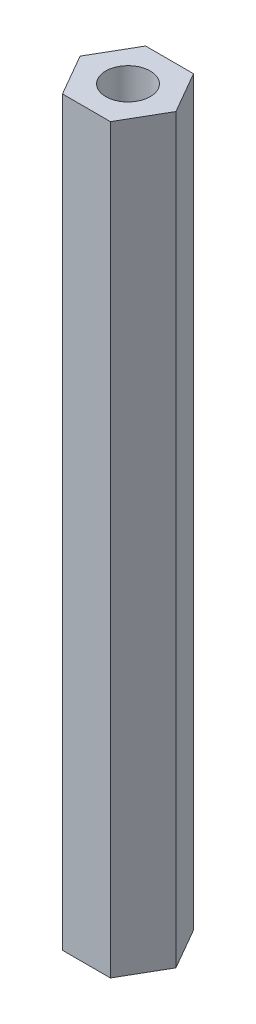
ISO-10303-21;
HEADER;
FILE_DESCRIPTION(('STEP AP214'),'2;1');
FILE_NAME('part.step','',(''),(''),'','','');
FILE_SCHEMA(('AUTOMOTIVE_DESIGN { 1 0 10303 214 1 1 1 1 }'));
ENDSEC;
DATA;
#1=APPLICATION_CONTEXT('core data for automotive mechanical design processes');
#2=APPLICATION_PROTOCOL_DEFINITION('international standard','automotive_design',2000,#1);
#3=PRODUCT_CONTEXT('',#1,'mechanical');
#4=PRODUCT('Part','Part','',(#3));
#5=PRODUCT_RELATED_PRODUCT_CATEGORY('part','',(#4));
#6=PRODUCT_DEFINITION_FORMATION('','',#4);
#7=PRODUCT_DEFINITION_CONTEXT('part definition',#1,'design');
#8=PRODUCT_DEFINITION('design','',#6,#7);
#9=PRODUCT_DEFINITION_SHAPE('','',#8);
#10=(LENGTH_UNIT() NAMED_UNIT(*) SI_UNIT(.MILLI.,.METRE.));
#11=(NAMED_UNIT(*) PLANE_ANGLE_UNIT() SI_UNIT($,.RADIAN.));
#12=(NAMED_UNIT(*) SI_UNIT($,.STERADIAN.) SOLID_ANGLE_UNIT());
#13=UNCERTAINTY_MEASURE_WITH_UNIT(LENGTH_MEASURE(1.E-05),#10,'distance_accuracy_value','');
#14=(GEOMETRIC_REPRESENTATION_CONTEXT(3) GLOBAL_UNCERTAINTY_ASSIGNED_CONTEXT((#13)) GLOBAL_UNIT_ASSIGNED_CONTEXT((#10,
#11,#12)) REPRESENTATION_CONTEXT('',''));
#15=CARTESIAN_POINT('',(0.,0.,0.));
#16=DIRECTION('',(0.,0.,1.));
#17=DIRECTION('',(1.,0.,0.));
#18=AXIS2_PLACEMENT_3D('',#15,#16,#17);
#19=CARTESIAN_POINT('',(0.,50.,0.));
#20=DIRECTION('',(0.,1.,0.));
#21=DIRECTION('',(0.,0.,1.));
#22=AXIS2_PLACEMENT_3D('',#19,#20,#21);
#23=PLANE('',#22);
#24=DIRECTION('',(-0.499496882066942,0.,-0.866315684266078));
#25=VECTOR('',#24,1.);
#26=CARTESIAN_POINT('',(3.23316096204306,50.,0.00187799205236423));
#27=LINE('',#26,#25);
#28=CARTESIAN_POINT('',(3.23316096204306,50.,0.00187799205236423));
#29=VERTEX_POINT('',#28);
#30=CARTESIAN_POINT('',(1.61820686984698,50.,-2.79906053162724));
#31=VERTEX_POINT('',#30);
#32=EDGE_CURVE('E130',#29,#31,#27,.T.);
#33=ORIENTED_EDGE('',*,*,#32,.T.);
#34=DIRECTION('',(-0.999999831304794,0.,-0.000580853151947535));
#35=VECTOR('',#34,1.);
#36=CARTESIAN_POINT('',(1.61820686984698,50.,-2.79906053162724));
#37=LINE('',#36,#35);
#38=CARTESIAN_POINT('',(-1.61495409219608,50.,-2.8009385236796));
#39=VERTEX_POINT('',#38);
#40=EDGE_CURVE('E88',#31,#39,#37,.T.);
#41=ORIENTED_EDGE('',*,*,#40,.T.);
#42=DIRECTION('',(-0.500502949237851,0.,0.865734831114131));
#43=VECTOR('',#42,1.);
#44=CARTESIAN_POINT('',(-1.61495409219608,50.,-2.8009385236796));
#45=LINE('',#44,#43);
#46=CARTESIAN_POINT('',(-3.23316096204306,50.,-0.00187799205236375));
#47=VERTEX_POINT('',#46);
#48=EDGE_CURVE('E101',#39,#47,#45,.T.);
#49=ORIENTED_EDGE('',*,*,#48,.T.);
#50=DIRECTION('',(0.499496882066942,0.,0.866315684266078));
#51=VECTOR('',#50,1.);
#52=CARTESIAN_POINT('',(-3.23316096204306,50.,-0.00187799205236375));
#53=LINE('',#52,#51);
#54=CARTESIAN_POINT('',(-1.61820686984698,50.,2.79906053162724));
#55=VERTEX_POINT('',#54);
#56=EDGE_CURVE('E95',#47,#55,#53,.T.);
#57=ORIENTED_EDGE('',*,*,#56,.T.);
#58=DIRECTION('',(0.999999831304794,0.,0.000580853151947401));
#59=VECTOR('',#58,1.);
#60=CARTESIAN_POINT('',(-1.61820686984698,50.,2.79906053162724));
#61=LINE('',#60,#59);
#62=CARTESIAN_POINT('',(1.61495409219608,50.,2.8009385236796));
#63=VERTEX_POINT('',#62);
#64=EDGE_CURVE('E99',#55,#63,#61,.T.);
#65=ORIENTED_EDGE('',*,*,#64,.T.);
#66=DIRECTION('',(0.500502949237852,0.,-0.865734831114131));
#67=VECTOR('',#66,1.);
#68=CARTESIAN_POINT('',(1.61495409219608,50.,2.8009385236796));
#69=LINE('',#68,#67);
#70=EDGE_CURVE('E51',#63,#29,#69,.T.);
#71=ORIENTED_EDGE('',*,*,#70,.T.);
#72=EDGE_LOOP('',(#33,#41,#49,#57,#65,#71));
#73=FACE_BOUND('',#72,.T.);
#74=CARTESIAN_POINT('',(0.,50.,0.));
#75=DIRECTION('',(0.,1.,0.));
#76=DIRECTION('',(0.,0.,1.));
#77=AXIS2_PLACEMENT_3D('',#74,#75,#76);
#78=CIRCLE('',#77,1.5);
#79=CARTESIAN_POINT('',(0.,50.,1.5));
#80=VERTEX_POINT('',#79);
#81=EDGE_CURVE('E123',#80,#80,#78,.T.);
#82=ORIENTED_EDGE('',*,*,#81,.F.);
#83=EDGE_LOOP('',(#82));
#84=FACE_BOUND('',#83,.T.);
#85=ADVANCED_FACE('F34',(#73,#84),#23,.T.);
#86=CARTESIAN_POINT('',(0.,0.,0.));
#87=DIRECTION('',(0.,1.,0.));
#88=DIRECTION('',(0.,0.,1.));
#89=AXIS2_PLACEMENT_3D('',#86,#87,#88);
#90=PLANE('',#89);
#91=DIRECTION('',(-0.499496882066942,0.,-0.866315684266078));
#92=VECTOR('',#91,1.);
#93=CARTESIAN_POINT('',(3.23316096204306,0.,0.00187799205236423));
#94=LINE('',#93,#92);
#95=CARTESIAN_POINT('',(3.23316096204306,0.,0.00187799205236423));
#96=VERTEX_POINT('',#95);
#97=CARTESIAN_POINT('',(1.61820686984698,0.,-2.79906053162724));
#98=VERTEX_POINT('',#97);
#99=EDGE_CURVE('E119',#96,#98,#94,.T.);
#100=ORIENTED_EDGE('',*,*,#99,.F.);
#101=DIRECTION('',(0.500502949237852,0.,-0.865734831114131));
#102=VECTOR('',#101,1.);
#103=CARTESIAN_POINT('',(1.61495409219608,0.,2.8009385236796));
#104=LINE('',#103,#102);
#105=CARTESIAN_POINT('',(1.61495409219608,0.,2.8009385236796));
#106=VERTEX_POINT('',#105);
#107=EDGE_CURVE('E80',#106,#96,#104,.T.);
#108=ORIENTED_EDGE('',*,*,#107,.F.);
#109=DIRECTION('',(0.999999831304794,0.,0.000580853151947401));
#110=VECTOR('',#109,1.);
#111=CARTESIAN_POINT('',(-1.61820686984698,0.,2.79906053162724));
#112=LINE('',#111,#110);
#113=CARTESIAN_POINT('',(-1.61820686984698,0.,2.79906053162724));
#114=VERTEX_POINT('',#113);
#115=EDGE_CURVE('E74',#114,#106,#112,.T.);
#116=ORIENTED_EDGE('',*,*,#115,.F.);
#117=DIRECTION('',(0.499496882066942,0.,0.866315684266078));
#118=VECTOR('',#117,1.);
#119=CARTESIAN_POINT('',(-3.23316096204306,0.,-0.00187799205236375));
#120=LINE('',#119,#118);
#121=CARTESIAN_POINT('',(-3.23316096204306,0.,-0.00187799205236375));
#122=VERTEX_POINT('',#121);
#123=EDGE_CURVE('E109',#122,#114,#120,.T.);
#124=ORIENTED_EDGE('',*,*,#123,.F.);
#125=DIRECTION('',(-0.500502949237851,0.,0.865734831114131));
#126=VECTOR('',#125,1.);
#127=CARTESIAN_POINT('',(-1.61495409219608,0.,-2.8009385236796));
#128=LINE('',#127,#126);
#129=CARTESIAN_POINT('',(-1.61495409219608,0.,-2.8009385236796));
#130=VERTEX_POINT('',#129);
#131=EDGE_CURVE('E125',#130,#122,#128,.T.);
#132=ORIENTED_EDGE('',*,*,#131,.F.);
#133=DIRECTION('',(-0.999999831304794,0.,-0.000580853151947535));
#134=VECTOR('',#133,1.);
#135=CARTESIAN_POINT('',(1.61820686984698,0.,-2.79906053162724));
#136=LINE('',#135,#134);
#137=EDGE_CURVE('E122',#98,#130,#136,.T.);
#138=ORIENTED_EDGE('',*,*,#137,.F.);
#139=EDGE_LOOP('',(#100,#108,#116,#124,#132,#138));
#140=FACE_BOUND('',#139,.T.);
#141=CARTESIAN_POINT('',(0.,0.,0.));
#142=DIRECTION('',(0.,1.,0.));
#143=DIRECTION('',(0.,0.,1.));
#144=AXIS2_PLACEMENT_3D('',#141,#142,#143);
#145=CIRCLE('',#144,1.5);
#146=CARTESIAN_POINT('',(0.,0.,1.5));
#147=VERTEX_POINT('',#146);
#148=EDGE_CURVE('E223',#147,#147,#145,.T.);
#149=ORIENTED_EDGE('',*,*,#148,.T.);
#150=EDGE_LOOP('',(#149));
#151=FACE_BOUND('',#150,.T.);
#152=ADVANCED_FACE('F139',(#140,#151),#90,.F.);
#153=CARTESIAN_POINT('',(3.23316096204306,50.,0.00187799205236423));
#154=DIRECTION('',(-0.866315684266078,0.,0.499496882066942));
#155=DIRECTION('',(0.499496882066942,0.,0.866315684266078));
#156=AXIS2_PLACEMENT_3D('',#153,#154,#155);
#157=PLANE('',#156);
#158=ORIENTED_EDGE('',*,*,#99,.T.);
#159=DIRECTION('',(0.,-1.,0.));
#160=VECTOR('',#159,1.);
#161=CARTESIAN_POINT('',(1.61820686984698,50.,-2.79906053162724));
#162=LINE('',#161,#160);
#163=EDGE_CURVE('E11',#31,#98,#162,.T.);
#164=ORIENTED_EDGE('',*,*,#163,.F.);
#165=ORIENTED_EDGE('',*,*,#32,.F.);
#166=DIRECTION('',(0.,-1.,0.));
#167=VECTOR('',#166,1.);
#168=CARTESIAN_POINT('',(3.23316096204306,50.,0.00187799205236423));
#169=LINE('',#168,#167);
#170=EDGE_CURVE('E115',#29,#96,#169,.T.);
#171=ORIENTED_EDGE('',*,*,#170,.T.);
#172=EDGE_LOOP('',(#158,#164,#165,#171));
#173=FACE_BOUND('',#172,.T.);
#174=ADVANCED_FACE('F36',(#173),#157,.F.);
#175=CARTESIAN_POINT('',(1.61820686984698,50.,-2.79906053162724));
#176=DIRECTION('',(-0.000580853151947535,0.,0.999999831304794));
#177=DIRECTION('',(0.999999831304794,0.,0.000580853151947535));
#178=AXIS2_PLACEMENT_3D('',#175,#176,#177);
#179=PLANE('',#178);
#180=ORIENTED_EDGE('',*,*,#137,.T.);
#181=DIRECTION('',(0.,-1.,0.));
#182=VECTOR('',#181,1.);
#183=CARTESIAN_POINT('',(-1.61495409219608,50.,-2.8009385236796));
#184=LINE('',#183,#182);
#185=EDGE_CURVE('E43',#39,#130,#184,.T.);
#186=ORIENTED_EDGE('',*,*,#185,.F.);
#187=ORIENTED_EDGE('',*,*,#40,.F.);
#188=ORIENTED_EDGE('',*,*,#163,.T.);
#189=EDGE_LOOP('',(#180,#186,#187,#188));
#190=FACE_BOUND('',#189,.T.);
#191=ADVANCED_FACE('F164',(#190),#179,.F.);
#192=CARTESIAN_POINT('',(-1.61495409219608,50.,-2.8009385236796));
#193=DIRECTION('',(0.865734831114131,0.,0.500502949237851));
#194=DIRECTION('',(0.500502949237851,0.,-0.865734831114131));
#195=AXIS2_PLACEMENT_3D('',#192,#193,#194);
#196=PLANE('',#195);
#197=ORIENTED_EDGE('',*,*,#131,.T.);
#198=DIRECTION('',(0.,-1.,0.));
#199=VECTOR('',#198,1.);
#200=CARTESIAN_POINT('',(-3.23316096204306,50.,-0.00187799205236375));
#201=LINE('',#200,#199);
#202=EDGE_CURVE('E110',#47,#122,#201,.T.);
#203=ORIENTED_EDGE('',*,*,#202,.F.);
#204=ORIENTED_EDGE('',*,*,#48,.F.);
#205=ORIENTED_EDGE('',*,*,#185,.T.);
#206=EDGE_LOOP('',(#197,#203,#204,#205));
#207=FACE_BOUND('',#206,.T.);
#208=ADVANCED_FACE('F136',(#207),#196,.F.);
#209=CARTESIAN_POINT('',(-3.23316096204306,50.,-0.00187799205236375));
#210=DIRECTION('',(0.866315684266078,0.,-0.499496882066942));
#211=DIRECTION('',(-0.499496882066942,0.,-0.866315684266078));
#212=AXIS2_PLACEMENT_3D('',#209,#210,#211);
#213=PLANE('',#212);
#214=ORIENTED_EDGE('',*,*,#123,.T.);
#215=DIRECTION('',(0.,-1.,0.));
#216=VECTOR('',#215,1.);
#217=CARTESIAN_POINT('',(-1.61820686984698,50.,2.79906053162724));
#218=LINE('',#217,#216);
#219=EDGE_CURVE('E106',#55,#114,#218,.T.);
#220=ORIENTED_EDGE('',*,*,#219,.F.);
#221=ORIENTED_EDGE('',*,*,#56,.F.);
#222=ORIENTED_EDGE('',*,*,#202,.T.);
#223=EDGE_LOOP('',(#214,#220,#221,#222));
#224=FACE_BOUND('',#223,.T.);
#225=ADVANCED_FACE('F107',(#224),#213,.F.);
#226=CARTESIAN_POINT('',(-1.61820686984698,50.,2.79906053162724));
#227=DIRECTION('',(0.000580853151947401,0.,-0.999999831304794));
#228=DIRECTION('',(-0.999999831304794,0.,-0.000580853151947401));
#229=AXIS2_PLACEMENT_3D('',#226,#227,#228);
#230=PLANE('',#229);
#231=ORIENTED_EDGE('',*,*,#115,.T.);
#232=DIRECTION('',(0.,-1.,0.));
#233=VECTOR('',#232,1.);
#234=CARTESIAN_POINT('',(1.61495409219608,50.,2.8009385236796));
#235=LINE('',#234,#233);
#236=EDGE_CURVE('E111',#63,#106,#235,.T.);
#237=ORIENTED_EDGE('',*,*,#236,.F.);
#238=ORIENTED_EDGE('',*,*,#64,.F.);
#239=ORIENTED_EDGE('',*,*,#219,.T.);
#240=EDGE_LOOP('',(#231,#237,#238,#239));
#241=FACE_BOUND('',#240,.T.);
#242=ADVANCED_FACE('F113',(#241),#230,.F.);
#243=CARTESIAN_POINT('',(1.61495409219608,50.,2.8009385236796));
#244=DIRECTION('',(-0.865734831114131,0.,-0.500502949237852));
#245=DIRECTION('',(-0.500502949237852,0.,0.865734831114131));
#246=AXIS2_PLACEMENT_3D('',#243,#244,#245);
#247=PLANE('',#246);
#248=ORIENTED_EDGE('',*,*,#107,.T.);
#249=ORIENTED_EDGE('',*,*,#170,.F.);
#250=ORIENTED_EDGE('',*,*,#70,.F.);
#251=ORIENTED_EDGE('',*,*,#236,.T.);
#252=EDGE_LOOP('',(#248,#249,#250,#251));
#253=FACE_BOUND('',#252,.T.);
#254=ADVANCED_FACE('F144',(#253),#247,.F.);
#255=CARTESIAN_POINT('',(0.,50.,0.));
#256=DIRECTION('',(0.,-1.,0.));
#257=DIRECTION('',(0.,0.,-1.));
#258=AXIS2_PLACEMENT_3D('',#255,#256,#257);
#259=CYLINDRICAL_SURFACE('',#258,1.5);
#260=ORIENTED_EDGE('',*,*,#81,.T.);
#261=EDGE_LOOP('',(#260));
#262=FACE_BOUND('',#261,.T.);
#263=ORIENTED_EDGE('',*,*,#148,.F.);
#264=EDGE_LOOP('',(#263));
#265=FACE_BOUND('',#264,.T.);
#266=ADVANCED_FACE('F146',(#262,#265),#259,.F.);
#267=CLOSED_SHELL('',(#85,#152,#174,#191,#208,#225,#242,#254,#266));
#268=MANIFOLD_SOLID_BREP('B2',#267);
#269=ADVANCED_BREP_SHAPE_REPRESENTATION('',(#18,#268),#14);
#270=SHAPE_DEFINITION_REPRESENTATION(#9,#269);
ENDSEC;
END-ISO-10303-21;
